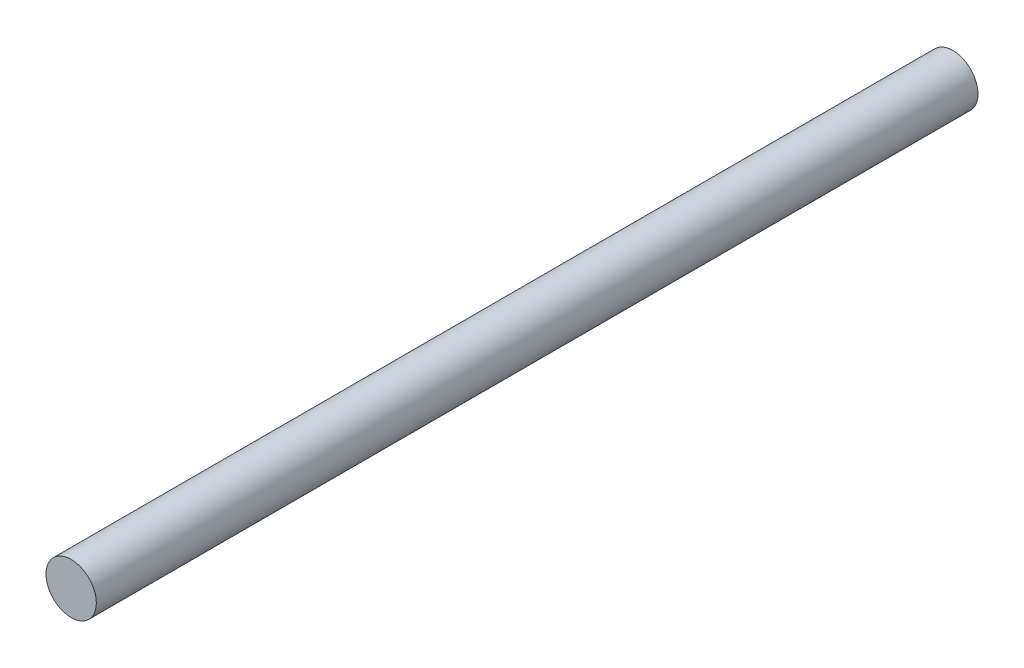
ISO-10303-21;
HEADER;
FILE_DESCRIPTION(('STEP AP214'),'2;1');
FILE_NAME('part.step','',(''),(''),'','','');
FILE_SCHEMA(('AUTOMOTIVE_DESIGN { 1 0 10303 214 1 1 1 1 }'));
ENDSEC;
DATA;
#1=APPLICATION_CONTEXT('core data for automotive mechanical design processes');
#2=APPLICATION_PROTOCOL_DEFINITION('international standard','automotive_design',2000,#1);
#3=PRODUCT_CONTEXT('',#1,'mechanical');
#4=PRODUCT('Part','Part','',(#3));
#5=PRODUCT_RELATED_PRODUCT_CATEGORY('part','',(#4));
#6=PRODUCT_DEFINITION_FORMATION('','',#4);
#7=PRODUCT_DEFINITION_CONTEXT('part definition',#1,'design');
#8=PRODUCT_DEFINITION('design','',#6,#7);
#9=PRODUCT_DEFINITION_SHAPE('','',#8);
#10=(LENGTH_UNIT() NAMED_UNIT(*) SI_UNIT(.MILLI.,.METRE.));
#11=(NAMED_UNIT(*) PLANE_ANGLE_UNIT() SI_UNIT($,.RADIAN.));
#12=(NAMED_UNIT(*) SI_UNIT($,.STERADIAN.) SOLID_ANGLE_UNIT());
#13=UNCERTAINTY_MEASURE_WITH_UNIT(LENGTH_MEASURE(1.E-05),#10,'distance_accuracy_value','');
#14=(GEOMETRIC_REPRESENTATION_CONTEXT(3) GLOBAL_UNCERTAINTY_ASSIGNED_CONTEXT((#13)) GLOBAL_UNIT_ASSIGNED_CONTEXT((#10,
#11,#12)) REPRESENTATION_CONTEXT('',''));
#15=CARTESIAN_POINT('',(0.,0.,0.));
#16=DIRECTION('',(0.,0.,1.));
#17=DIRECTION('',(1.,0.,0.));
#18=AXIS2_PLACEMENT_3D('',#15,#16,#17);
#19=CARTESIAN_POINT('',(0.,0.,70.));
#20=DIRECTION('',(0.,0.,-1.));
#21=DIRECTION('',(-1.,0.,0.));
#22=AXIS2_PLACEMENT_3D('',#19,#20,#21);
#23=CYLINDRICAL_SURFACE('',#22,2.);
#24=CARTESIAN_POINT('',(0.,0.,70.));
#25=DIRECTION('',(0.,0.,1.));
#26=DIRECTION('',(1.,0.,0.));
#27=AXIS2_PLACEMENT_3D('',#24,#25,#26);
#28=CIRCLE('',#27,2.);
#29=CARTESIAN_POINT('',(2.,0.,70.));
#30=VERTEX_POINT('',#29);
#31=EDGE_CURVE('E10',#30,#30,#28,.T.);
#32=ORIENTED_EDGE('',*,*,#31,.F.);
#33=EDGE_LOOP('',(#32));
#34=FACE_BOUND('',#33,.T.);
#35=CARTESIAN_POINT('',(0.,0.,0.));
#36=DIRECTION('',(0.,0.,1.));
#37=DIRECTION('',(1.,0.,0.));
#38=AXIS2_PLACEMENT_3D('',#35,#36,#37);
#39=CIRCLE('',#38,2.);
#40=CARTESIAN_POINT('',(2.,0.,0.));
#41=VERTEX_POINT('',#40);
#42=EDGE_CURVE('E34',#41,#41,#39,.T.);
#43=ORIENTED_EDGE('',*,*,#42,.T.);
#44=EDGE_LOOP('',(#43));
#45=FACE_BOUND('',#44,.T.);
#46=ADVANCED_FACE('F31',(#34,#45),#23,.T.);
#47=CARTESIAN_POINT('',(0.,0.,70.));
#48=DIRECTION('',(0.,0.,1.));
#49=DIRECTION('',(1.,0.,0.));
#50=AXIS2_PLACEMENT_3D('',#47,#48,#49);
#51=PLANE('',#50);
#52=ORIENTED_EDGE('',*,*,#31,.T.);
#53=EDGE_LOOP('',(#52));
#54=FACE_BOUND('',#53,.T.);
#55=ADVANCED_FACE('F46',(#54),#51,.T.);
#56=CARTESIAN_POINT('',(0.,0.,0.));
#57=DIRECTION('',(0.,0.,1.));
#58=DIRECTION('',(1.,0.,0.));
#59=AXIS2_PLACEMENT_3D('',#56,#57,#58);
#60=PLANE('',#59);
#61=ORIENTED_EDGE('',*,*,#42,.F.);
#62=EDGE_LOOP('',(#61));
#63=FACE_BOUND('',#62,.T.);
#64=ADVANCED_FACE('F44',(#63),#60,.F.);
#65=CLOSED_SHELL('',(#46,#55,#64));
#66=MANIFOLD_SOLID_BREP('B2',#65);
#67=ADVANCED_BREP_SHAPE_REPRESENTATION('',(#18,#66),#14);
#68=SHAPE_DEFINITION_REPRESENTATION(#9,#67);
ENDSEC;
END-ISO-10303-21;
